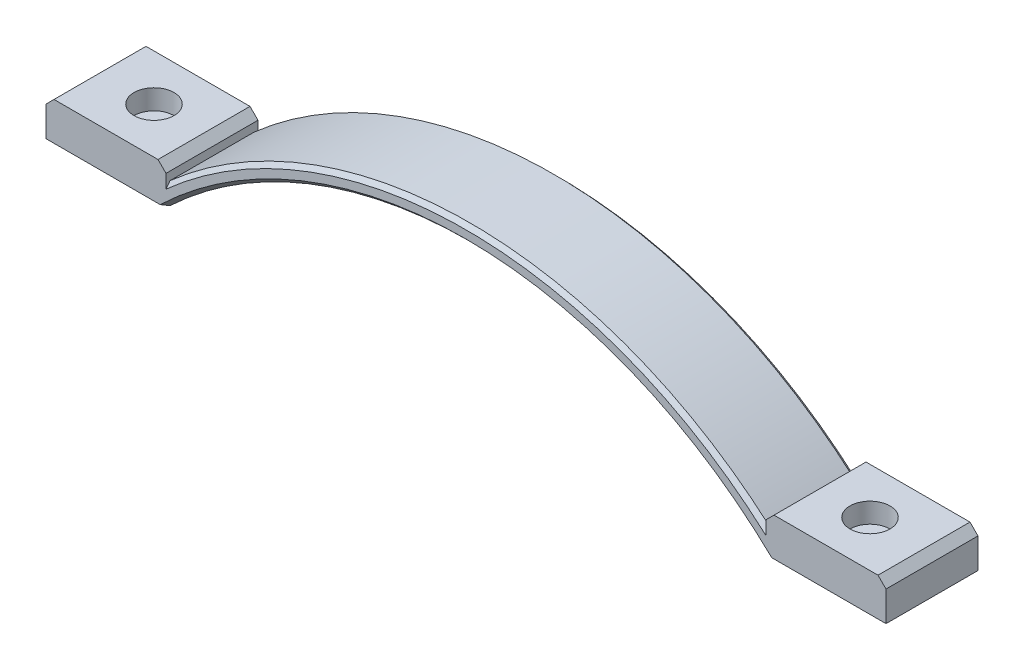
ISO-10303-21;
HEADER;
FILE_DESCRIPTION(('STEP AP214'),'2;1');
FILE_NAME('part.step','',(''),(''),'','','');
FILE_SCHEMA(('AUTOMOTIVE_DESIGN { 1 0 10303 214 1 1 1 1 }'));
ENDSEC;
DATA;
#1=APPLICATION_CONTEXT('core data for automotive mechanical design processes');
#2=APPLICATION_PROTOCOL_DEFINITION('international standard','automotive_design',2000,#1);
#3=PRODUCT_CONTEXT('',#1,'mechanical');
#4=PRODUCT('Part','Part','',(#3));
#5=PRODUCT_RELATED_PRODUCT_CATEGORY('part','',(#4));
#6=PRODUCT_DEFINITION_FORMATION('','',#4);
#7=PRODUCT_DEFINITION_CONTEXT('part definition',#1,'design');
#8=PRODUCT_DEFINITION('design','',#6,#7);
#9=PRODUCT_DEFINITION_SHAPE('','',#8);
#10=(LENGTH_UNIT() NAMED_UNIT(*) SI_UNIT(.MILLI.,.METRE.));
#11=(NAMED_UNIT(*) PLANE_ANGLE_UNIT() SI_UNIT($,.RADIAN.));
#12=(NAMED_UNIT(*) SI_UNIT($,.STERADIAN.) SOLID_ANGLE_UNIT());
#13=UNCERTAINTY_MEASURE_WITH_UNIT(LENGTH_MEASURE(1.E-05),#10,'distance_accuracy_value','');
#14=(GEOMETRIC_REPRESENTATION_CONTEXT(3) GLOBAL_UNCERTAINTY_ASSIGNED_CONTEXT((#13)) GLOBAL_UNIT_ASSIGNED_CONTEXT((#10,
#11,#12)) REPRESENTATION_CONTEXT('',''));
#15=CARTESIAN_POINT('',(0.,0.,0.));
#16=DIRECTION('',(0.,0.,1.));
#17=DIRECTION('',(1.,0.,0.));
#18=AXIS2_PLACEMENT_3D('',#15,#16,#17);
#19=CARTESIAN_POINT('',(-105.,0.,-11.5));
#20=DIRECTION('',(-1.,0.,0.));
#21=DIRECTION('',(0.,0.,1.));
#22=AXIS2_PLACEMENT_3D('',#19,#20,#21);
#23=PLANE('',#22);
#24=DIRECTION('',(0.,-1.,0.));
#25=VECTOR('',#24,1.);
#26=CARTESIAN_POINT('',(-105.,0.,11.5));
#27=LINE('',#26,#25);
#28=CARTESIAN_POINT('',(-105.,7.50000000000003,11.5));
#29=VERTEX_POINT('',#28);
#30=CARTESIAN_POINT('',(-105.,0.,11.5));
#31=VERTEX_POINT('',#30);
#32=EDGE_CURVE('E164',#29,#31,#27,.T.);
#33=ORIENTED_EDGE('',*,*,#32,.F.);
#34=DIRECTION('',(0.,0.,-1.));
#35=VECTOR('',#34,1.);
#36=CARTESIAN_POINT('',(-105.,7.50000000000003,-11.5));
#37=LINE('',#36,#35);
#38=CARTESIAN_POINT('',(-105.,7.50000000000002,-11.5));
#39=VERTEX_POINT('',#38);
#40=EDGE_CURVE('E362',#29,#39,#37,.T.);
#41=ORIENTED_EDGE('',*,*,#40,.T.);
#42=DIRECTION('',(0.,-1.,0.));
#43=VECTOR('',#42,1.);
#44=CARTESIAN_POINT('',(-105.,0.,-11.5));
#45=LINE('',#44,#43);
#46=CARTESIAN_POINT('',(-105.,0.,-11.5));
#47=VERTEX_POINT('',#46);
#48=EDGE_CURVE('E180',#39,#47,#45,.T.);
#49=ORIENTED_EDGE('',*,*,#48,.T.);
#50=DIRECTION('',(0.,0.,1.));
#51=VECTOR('',#50,1.);
#52=CARTESIAN_POINT('',(-105.,0.,-11.5));
#53=LINE('',#52,#51);
#54=EDGE_CURVE('E178',#47,#31,#53,.T.);
#55=ORIENTED_EDGE('',*,*,#54,.T.);
#56=EDGE_LOOP('',(#33,#41,#49,#55));
#57=FACE_BOUND('',#56,.T.);
#58=ADVANCED_FACE('F37',(#57),#23,.T.);
#59=CARTESIAN_POINT('',(-105.,9.5,-11.5));
#60=DIRECTION('',(0.,1.,0.));
#61=DIRECTION('',(0.,0.,1.));
#62=AXIS2_PLACEMENT_3D('',#59,#60,#61);
#63=PLANE('',#62);
#64=CARTESIAN_POINT('',(-89.5,9.5,0.));
#65=DIRECTION('',(0.,1.,0.));
#66=DIRECTION('',(0.,0.,1.));
#67=AXIS2_PLACEMENT_3D('',#64,#65,#66);
#68=CIRCLE('',#67,5.);
#69=CARTESIAN_POINT('',(-89.5,9.5,5.));
#70=VERTEX_POINT('',#69);
#71=EDGE_CURVE('E606',#70,#70,#68,.T.);
#72=ORIENTED_EDGE('',*,*,#71,.F.);
#73=EDGE_LOOP('',(#72));
#74=FACE_BOUND('',#73,.T.);
#75=DIRECTION('',(-1.,0.,0.));
#76=VECTOR('',#75,1.);
#77=CARTESIAN_POINT('',(-105.,9.5,-11.5));
#78=LINE('',#77,#76);
#79=CARTESIAN_POINT('',(-77.,9.5,-11.5));
#80=VERTEX_POINT('',#79);
#81=CARTESIAN_POINT('',(-103.,9.5,-11.5));
#82=VERTEX_POINT('',#81);
#83=EDGE_CURVE('E185',#80,#82,#78,.T.);
#84=ORIENTED_EDGE('',*,*,#83,.T.);
#85=DIRECTION('',(0.,0.,1.));
#86=VECTOR('',#85,1.);
#87=CARTESIAN_POINT('',(-103.,9.5,-11.5));
#88=LINE('',#87,#86);
#89=CARTESIAN_POINT('',(-103.,9.5,11.5));
#90=VERTEX_POINT('',#89);
#91=EDGE_CURVE('E414',#82,#90,#88,.T.);
#92=ORIENTED_EDGE('',*,*,#91,.T.);
#93=DIRECTION('',(-1.,0.,0.));
#94=VECTOR('',#93,1.);
#95=CARTESIAN_POINT('',(-105.,9.5,11.5));
#96=LINE('',#95,#94);
#97=CARTESIAN_POINT('',(-77.,9.5,11.5));
#98=VERTEX_POINT('',#97);
#99=EDGE_CURVE('E207',#98,#90,#96,.T.);
#100=ORIENTED_EDGE('',*,*,#99,.F.);
#101=DIRECTION('',(0.,0.,-1.));
#102=VECTOR('',#101,1.);
#103=CARTESIAN_POINT('',(-77.,9.5,-11.5));
#104=LINE('',#103,#102);
#105=EDGE_CURVE('E419',#98,#80,#104,.T.);
#106=ORIENTED_EDGE('',*,*,#105,.T.);
#107=EDGE_LOOP('',(#84,#92,#100,#106));
#108=FACE_BOUND('',#107,.T.);
#109=ADVANCED_FACE('F291',(#74,#108),#63,.T.);
#110=CARTESIAN_POINT('',(-75.,9.5,-11.5));
#111=DIRECTION('',(1.,0.,0.));
#112=DIRECTION('',(0.,0.,-1.));
#113=AXIS2_PLACEMENT_3D('',#110,#111,#112);
#114=PLANE('',#113);
#115=DIRECTION('',(0.,1.,0.));
#116=VECTOR('',#115,1.);
#117=CARTESIAN_POINT('',(-75.,9.5,-11.5));
#118=LINE('',#117,#116);
#119=CARTESIAN_POINT('',(-75.,4.07562753796724,-11.5));
#120=VERTEX_POINT('',#119);
#121=CARTESIAN_POINT('',(-75.,7.49999999999997,-11.5));
#122=VERTEX_POINT('',#121);
#123=EDGE_CURVE('E220',#120,#122,#118,.T.);
#124=ORIENTED_EDGE('',*,*,#123,.T.);
#125=DIRECTION('',(0.,0.,1.));
#126=VECTOR('',#125,1.);
#127=CARTESIAN_POINT('',(-75.,7.49999999999997,-11.5));
#128=LINE('',#127,#126);
#129=CARTESIAN_POINT('',(-75.,7.49999999999999,11.5));
#130=VERTEX_POINT('',#129);
#131=EDGE_CURVE('E367',#122,#130,#128,.T.);
#132=ORIENTED_EDGE('',*,*,#131,.T.);
#133=DIRECTION('',(0.,1.,0.));
#134=VECTOR('',#133,1.);
#135=CARTESIAN_POINT('',(-75.,9.5,11.5));
#136=LINE('',#135,#134);
#137=CARTESIAN_POINT('',(-75.,4.07562753796728,11.5));
#138=VERTEX_POINT('',#137);
#139=EDGE_CURVE('E204',#138,#130,#136,.T.);
#140=ORIENTED_EDGE('',*,*,#139,.F.);
#141=CARTESIAN_POINT('',(-75.,4.07562753796728,11.5));
#142=CARTESIAN_POINT('',(-75.,4.29901392061839,11.3337087795045));
#143=CARTESIAN_POINT('',(-75.,4.52226006841741,11.1672298356614));
#144=CARTESIAN_POINT('',(-75.,4.96847189291119,10.8338965023257));
#145=CARTESIAN_POINT('',(-75.,5.19143756960771,10.6670421128355));
#146=CARTESIAN_POINT('',(-75.,5.4142630114539,10.5));
#147=B_SPLINE_CURVE_WITH_KNOTS('',3,(#141,#142,#143,#144,#145,#146),.UNSPECIFIED.,.F.,.F.,(4,2,
4),(0.,0.835456001984573,1.67091199872642),.UNSPECIFIED.);
#148=CARTESIAN_POINT('',(-75.,5.4142630114539,10.5));
#149=VERTEX_POINT('',#148);
#150=EDGE_CURVE('E320',#138,#149,#147,.T.);
#151=ORIENTED_EDGE('',*,*,#150,.T.);
#152=DIRECTION('',(0.,0.,1.));
#153=VECTOR('',#152,1.);
#154=CARTESIAN_POINT('',(-75.,5.4142630114539,-11.5));
#155=LINE('',#154,#153);
#156=CARTESIAN_POINT('',(-75.,5.4142630114539,-10.5));
#157=VERTEX_POINT('',#156);
#158=EDGE_CURVE('E225',#157,#149,#155,.T.);
#159=ORIENTED_EDGE('',*,*,#158,.F.);
#160=CARTESIAN_POINT('',(-75.,5.4142630114539,-10.5));
#161=CARTESIAN_POINT('',(-75.,5.19143756960771,-10.6670421128355));
#162=CARTESIAN_POINT('',(-75.,4.96847189291118,-10.8338965023257));
#163=CARTESIAN_POINT('',(-75.,4.52226006841739,-11.1672298356614));
#164=CARTESIAN_POINT('',(-75.,4.29901392061837,-11.3337087795045));
#165=CARTESIAN_POINT('',(-75.,4.07562753796724,-11.5));
#166=B_SPLINE_CURVE_WITH_KNOTS('',3,(#160,#161,#162,#163,#164,#165),.UNSPECIFIED.,.F.,.F.,(4,2,
4),(0.,0.835455996741874,1.67091199872648),.UNSPECIFIED.);
#167=EDGE_CURVE('E313',#157,#120,#166,.T.);
#168=ORIENTED_EDGE('',*,*,#167,.T.);
#169=EDGE_LOOP('',(#124,#132,#140,#151,#159,#168));
#170=FACE_BOUND('',#169,.T.);
#171=ADVANCED_FACE('F295',(#170),#114,.T.);
#172=CARTESIAN_POINT('',(0.,-79.5344507533778,-11.5));
#173=DIRECTION('',(0.,0.,1.));
#174=DIRECTION('',(1.,0.,0.));
#175=AXIS2_PLACEMENT_3D('',#172,#173,#174);
#176=CYLINDRICAL_SURFACE('',#175,113.319389207228);
#177=DIRECTION('',(0.,0.,1.));
#178=VECTOR('',#177,1.);
#179=CARTESIAN_POINT('',(75.,5.4142630114539,-11.5));
#180=LINE('',#179,#178);
#181=CARTESIAN_POINT('',(75.,5.4142630114539,-10.5));
#182=VERTEX_POINT('',#181);
#183=CARTESIAN_POINT('',(75.,5.4142630114539,10.5));
#184=VERTEX_POINT('',#183);
#185=EDGE_CURVE('E229',#182,#184,#180,.T.);
#186=ORIENTED_EDGE('',*,*,#185,.F.);
#187=CARTESIAN_POINT('',(0.,-79.5344507533778,-10.5));
#188=DIRECTION('',(0.,0.,1.));
#189=DIRECTION('',(1.,0.,0.));
#190=AXIS2_PLACEMENT_3D('',#187,#188,#189);
#191=CIRCLE('',#190,113.319389207228);
#192=EDGE_CURVE('E385',#182,#157,#191,.T.);
#193=ORIENTED_EDGE('',*,*,#192,.T.);
#194=ORIENTED_EDGE('',*,*,#158,.T.);
#195=CARTESIAN_POINT('',(0.,-79.5344507533778,10.5));
#196=DIRECTION('',(0.,0.,1.));
#197=DIRECTION('',(1.,0.,0.));
#198=AXIS2_PLACEMENT_3D('',#195,#196,#197);
#199=CIRCLE('',#198,113.319389207228);
#200=EDGE_CURVE('E388',#149,#184,#199,.F.);
#201=ORIENTED_EDGE('',*,*,#200,.T.);
#202=EDGE_LOOP('',(#186,#193,#194,#201));
#203=FACE_BOUND('',#202,.T.);
#204=ADVANCED_FACE('F301',(#203),#176,.T.);
#205=CARTESIAN_POINT('',(75.,9.5,-11.5));
#206=DIRECTION('',(-1.,0.,0.));
#207=DIRECTION('',(0.,0.,1.));
#208=AXIS2_PLACEMENT_3D('',#205,#206,#207);
#209=PLANE('',#208);
#210=DIRECTION('',(0.,-1.,0.));
#211=VECTOR('',#210,1.);
#212=CARTESIAN_POINT('',(75.,9.5,11.5));
#213=LINE('',#212,#211);
#214=CARTESIAN_POINT('',(75.,7.49999999999997,11.5));
#215=VERTEX_POINT('',#214);
#216=CARTESIAN_POINT('',(75.,4.07562753796728,11.5));
#217=VERTEX_POINT('',#216);
#218=EDGE_CURVE('E202',#215,#217,#213,.T.);
#219=ORIENTED_EDGE('',*,*,#218,.F.);
#220=DIRECTION('',(0.,0.,-1.));
#221=VECTOR('',#220,1.);
#222=CARTESIAN_POINT('',(75.,7.49999999999997,-11.5));
#223=LINE('',#222,#221);
#224=CARTESIAN_POINT('',(75.,7.49999999999997,-11.5));
#225=VERTEX_POINT('',#224);
#226=EDGE_CURVE('E45',#215,#225,#223,.T.);
#227=ORIENTED_EDGE('',*,*,#226,.T.);
#228=DIRECTION('',(0.,-1.,0.));
#229=VECTOR('',#228,1.);
#230=CARTESIAN_POINT('',(75.,9.5,-11.5));
#231=LINE('',#230,#229);
#232=CARTESIAN_POINT('',(75.,4.07562753796724,-11.5));
#233=VERTEX_POINT('',#232);
#234=EDGE_CURVE('E218',#225,#233,#231,.T.);
#235=ORIENTED_EDGE('',*,*,#234,.T.);
#236=CARTESIAN_POINT('',(75.,4.07562753796724,-11.5));
#237=CARTESIAN_POINT('',(75.,4.29901392061837,-11.3337087795045));
#238=CARTESIAN_POINT('',(75.,4.52226006841739,-11.1672298356614));
#239=CARTESIAN_POINT('',(75.,4.96847189291119,-10.8338965023257));
#240=CARTESIAN_POINT('',(75.,5.19143756960771,-10.6670421128355));
#241=CARTESIAN_POINT('',(75.,5.41426301145389,-10.5));
#242=B_SPLINE_CURVE_WITH_KNOTS('',3,(#236,#237,#238,#239,#240,#241),.UNSPECIFIED.,.F.,.F.,(4,2,
4),(0.,0.835456001984603,1.67091199872648),.UNSPECIFIED.);
#243=EDGE_CURVE('E326',#233,#182,#242,.T.);
#244=ORIENTED_EDGE('',*,*,#243,.T.);
#245=ORIENTED_EDGE('',*,*,#185,.T.);
#246=CARTESIAN_POINT('',(75.,5.4142630114539,10.5));
#247=CARTESIAN_POINT('',(75.,5.19143756960771,10.6670421128355));
#248=CARTESIAN_POINT('',(75.,4.96847189291119,10.8338965023257));
#249=CARTESIAN_POINT('',(75.,4.52226006841741,11.1672298356614));
#250=CARTESIAN_POINT('',(75.,4.29901392061839,11.3337087795045));
#251=CARTESIAN_POINT('',(75.,4.07562753796728,11.5));
#252=B_SPLINE_CURVE_WITH_KNOTS('',3,(#246,#247,#248,#249,#250,#251),.UNSPECIFIED.,.F.,.F.,(4,2,
4),(0.,0.835455996741844,1.67091199872642),.UNSPECIFIED.);
#253=EDGE_CURVE('E325',#184,#217,#252,.T.);
#254=ORIENTED_EDGE('',*,*,#253,.T.);
#255=EDGE_LOOP('',(#219,#227,#235,#244,#245,#254));
#256=FACE_BOUND('',#255,.T.);
#257=ADVANCED_FACE('F374',(#256),#209,.T.);
#258=CARTESIAN_POINT('',(105.,9.50000000000003,-11.5));
#259=DIRECTION('',(0.,1.,0.));
#260=DIRECTION('',(-1.,0.,0.));
#261=AXIS2_PLACEMENT_3D('',#258,#259,#260);
#262=PLANE('',#261);
#263=CARTESIAN_POINT('',(89.5,9.5,0.));
#264=DIRECTION('',(0.,1.,0.));
#265=DIRECTION('',(0.,0.,-1.));
#266=AXIS2_PLACEMENT_3D('',#263,#264,#265);
#267=CIRCLE('',#266,5.);
#268=CARTESIAN_POINT('',(89.5,9.5,-5.00000000000003));
#269=VERTEX_POINT('',#268);
#270=EDGE_CURVE('E607',#269,#269,#267,.T.);
#271=ORIENTED_EDGE('',*,*,#270,.F.);
#272=EDGE_LOOP('',(#271));
#273=FACE_BOUND('',#272,.T.);
#274=DIRECTION('',(-1.,0.,0.));
#275=VECTOR('',#274,1.);
#276=CARTESIAN_POINT('',(105.,9.50000000000003,-11.5));
#277=LINE('',#276,#275);
#278=CARTESIAN_POINT('',(103.,9.50000000000002,-11.5));
#279=VERTEX_POINT('',#278);
#280=CARTESIAN_POINT('',(77.,9.5,-11.5));
#281=VERTEX_POINT('',#280);
#282=EDGE_CURVE('E216',#279,#281,#277,.T.);
#283=ORIENTED_EDGE('',*,*,#282,.T.);
#284=DIRECTION('',(0.,0.,1.));
#285=VECTOR('',#284,1.);
#286=CARTESIAN_POINT('',(77.,9.5,-11.5));
#287=LINE('',#286,#285);
#288=CARTESIAN_POINT('',(77.0000000000001,9.50000000000002,11.5));
#289=VERTEX_POINT('',#288);
#290=EDGE_CURVE('E357',#281,#289,#287,.T.);
#291=ORIENTED_EDGE('',*,*,#290,.T.);
#292=DIRECTION('',(-1.,0.,0.));
#293=VECTOR('',#292,1.);
#294=CARTESIAN_POINT('',(105.,9.50000000000003,11.5));
#295=LINE('',#294,#293);
#296=CARTESIAN_POINT('',(103.,9.50000000000002,11.5));
#297=VERTEX_POINT('',#296);
#298=EDGE_CURVE('E199',#297,#289,#295,.T.);
#299=ORIENTED_EDGE('',*,*,#298,.F.);
#300=DIRECTION('',(0.,0.,-1.));
#301=VECTOR('',#300,1.);
#302=CARTESIAN_POINT('',(103.,9.50000000000002,-11.5));
#303=LINE('',#302,#301);
#304=EDGE_CURVE('E370',#297,#279,#303,.T.);
#305=ORIENTED_EDGE('',*,*,#304,.T.);
#306=EDGE_LOOP('',(#283,#291,#299,#305));
#307=FACE_BOUND('',#306,.T.);
#308=ADVANCED_FACE('F438',(#273,#307),#262,.T.);
#309=CARTESIAN_POINT('',(105.,0.,-11.5));
#310=DIRECTION('',(1.,0.,0.));
#311=DIRECTION('',(0.,1.,0.));
#312=AXIS2_PLACEMENT_3D('',#309,#310,#311);
#313=PLANE('',#312);
#314=DIRECTION('',(0.,1.,0.));
#315=VECTOR('',#314,1.);
#316=CARTESIAN_POINT('',(105.,0.,-11.5));
#317=LINE('',#316,#315);
#318=CARTESIAN_POINT('',(105.,0.,-11.5));
#319=VERTEX_POINT('',#318);
#320=CARTESIAN_POINT('',(105.,7.49999999999999,-11.5));
#321=VERTEX_POINT('',#320);
#322=EDGE_CURVE('E214',#319,#321,#317,.T.);
#323=ORIENTED_EDGE('',*,*,#322,.T.);
#324=DIRECTION('',(0.,0.,1.));
#325=VECTOR('',#324,1.);
#326=CARTESIAN_POINT('',(105.,7.49999999999999,-11.5));
#327=LINE('',#326,#325);
#328=CARTESIAN_POINT('',(105.,7.49999999999997,11.5));
#329=VERTEX_POINT('',#328);
#330=EDGE_CURVE('E11',#321,#329,#327,.T.);
#331=ORIENTED_EDGE('',*,*,#330,.T.);
#332=DIRECTION('',(0.,1.,0.));
#333=VECTOR('',#332,1.);
#334=CARTESIAN_POINT('',(105.,0.,11.5));
#335=LINE('',#334,#333);
#336=CARTESIAN_POINT('',(105.,0.,11.5));
#337=VERTEX_POINT('',#336);
#338=EDGE_CURVE('E193',#337,#329,#335,.T.);
#339=ORIENTED_EDGE('',*,*,#338,.F.);
#340=DIRECTION('',(0.,0.,1.));
#341=VECTOR('',#340,1.);
#342=CARTESIAN_POINT('',(105.,0.,-11.5));
#343=LINE('',#342,#341);
#344=EDGE_CURVE('E232',#319,#337,#343,.T.);
#345=ORIENTED_EDGE('',*,*,#344,.F.);
#346=EDGE_LOOP('',(#323,#331,#339,#345));
#347=FACE_BOUND('',#346,.T.);
#348=ADVANCED_FACE('F408',(#347),#313,.T.);
#349=CARTESIAN_POINT('',(105.,0.,-11.5));
#350=DIRECTION('',(0.,-1.,0.));
#351=DIRECTION('',(1.,0.,0.));
#352=AXIS2_PLACEMENT_3D('',#349,#350,#351);
#353=PLANE('',#352);
#354=DIRECTION('',(1.,0.,0.));
#355=VECTOR('',#354,1.);
#356=CARTESIAN_POINT('',(105.,0.,11.5));
#357=LINE('',#356,#355);
#358=CARTESIAN_POINT('',(76.4502372685295,0.,11.5));
#359=VERTEX_POINT('',#358);
#360=EDGE_CURVE('E191',#359,#337,#357,.T.);
#361=ORIENTED_EDGE('',*,*,#360,.F.);
#362=CARTESIAN_POINT('',(76.4502372685295,0.,11.5));
#363=CARTESIAN_POINT('',(76.2089222787129,0.,11.3327659724251));
#364=CARTESIAN_POINT('',(75.967411678853,0.,11.1658156258252));
#365=CARTESIAN_POINT('',(75.4839992560148,0.,10.8324822924848));
#366=CARTESIAN_POINT('',(75.2420974330315,0.,10.6660993057514));
#367=CARTESIAN_POINT('',(75.,0.,10.5));
#368=B_SPLINE_CURVE_WITH_KNOTS('',3,(#362,#363,#364,#365,#366,#367),.UNSPECIFIED.,.F.,.F.,(4,2,
4),(0.,0.880794012621937,1.76158803629188),.UNSPECIFIED.);
#369=CARTESIAN_POINT('',(75.,0.,10.5));
#370=VERTEX_POINT('',#369);
#371=EDGE_CURVE('E250',#359,#370,#368,.T.);
#372=ORIENTED_EDGE('',*,*,#371,.T.);
#373=DIRECTION('',(0.,0.,1.));
#374=VECTOR('',#373,1.);
#375=CARTESIAN_POINT('',(75.,0.,-11.5));
#376=LINE('',#375,#374);
#377=CARTESIAN_POINT('',(75.,0.,-10.5));
#378=VERTEX_POINT('',#377);
#379=EDGE_CURVE('E235',#378,#370,#376,.T.);
#380=ORIENTED_EDGE('',*,*,#379,.F.);
#381=CARTESIAN_POINT('',(75.,0.,-10.5));
#382=CARTESIAN_POINT('',(75.2420974330315,0.,-10.6660993057514));
#383=CARTESIAN_POINT('',(75.4839992560148,0.,-10.8324822924848));
#384=CARTESIAN_POINT('',(75.9674116788531,0.,-11.1658156258252));
#385=CARTESIAN_POINT('',(76.2089222787129,0.,-11.3327659724252));
#386=CARTESIAN_POINT('',(76.4502372685295,0.,-11.5));
#387=B_SPLINE_CURVE_WITH_KNOTS('',3,(#381,#382,#383,#384,#385,#386),.UNSPECIFIED.,.F.,.F.,(4,2,
4),(0.,0.880794023669939,1.76158803629186),.UNSPECIFIED.);
#388=CARTESIAN_POINT('',(76.4502372685295,0.,-11.5));
#389=VERTEX_POINT('',#388);
#390=EDGE_CURVE('E243',#378,#389,#387,.T.);
#391=ORIENTED_EDGE('',*,*,#390,.T.);
#392=DIRECTION('',(1.,0.,0.));
#393=VECTOR('',#392,1.);
#394=CARTESIAN_POINT('',(105.,0.,-11.5));
#395=LINE('',#394,#393);
#396=EDGE_CURVE('E212',#389,#319,#395,.T.);
#397=ORIENTED_EDGE('',*,*,#396,.T.);
#398=ORIENTED_EDGE('',*,*,#344,.T.);
#399=EDGE_LOOP('',(#361,#372,#380,#391,#397,#398));
#400=FACE_BOUND('',#399,.T.);
#401=ADVANCED_FACE('F256',(#400),#353,.T.);
#402=CARTESIAN_POINT('',(0.,-79.5344507533778,-11.5));
#403=DIRECTION('',(0.,0.,1.));
#404=DIRECTION('',(1.,0.,0.));
#405=AXIS2_PLACEMENT_3D('',#402,#403,#404);
#406=CYLINDRICAL_SURFACE('',#405,109.319389207228);
#407=ORIENTED_EDGE('',*,*,#379,.T.);
#408=CARTESIAN_POINT('',(0.,-79.5344507533778,10.5));
#409=DIRECTION('',(0.,0.,1.));
#410=DIRECTION('',(1.,0.,0.));
#411=AXIS2_PLACEMENT_3D('',#408,#409,#410);
#412=CIRCLE('',#411,109.319389207228);
#413=CARTESIAN_POINT('',(-75.,0.,10.5));
#414=VERTEX_POINT('',#413);
#415=EDGE_CURVE('E280',#370,#414,#412,.T.);
#416=ORIENTED_EDGE('',*,*,#415,.T.);
#417=DIRECTION('',(0.,0.,1.));
#418=VECTOR('',#417,1.);
#419=CARTESIAN_POINT('',(-75.,0.,-11.5));
#420=LINE('',#419,#418);
#421=CARTESIAN_POINT('',(-75.,0.,-10.5));
#422=VERTEX_POINT('',#421);
#423=EDGE_CURVE('E184',#422,#414,#420,.T.);
#424=ORIENTED_EDGE('',*,*,#423,.F.);
#425=CARTESIAN_POINT('',(0.,-79.5344507533778,-10.5));
#426=DIRECTION('',(0.,0.,1.));
#427=DIRECTION('',(1.,0.,0.));
#428=AXIS2_PLACEMENT_3D('',#425,#426,#427);
#429=CIRCLE('',#428,109.319389207228);
#430=EDGE_CURVE('E398',#422,#378,#429,.F.);
#431=ORIENTED_EDGE('',*,*,#430,.T.);
#432=EDGE_LOOP('',(#407,#416,#424,#431));
#433=FACE_BOUND('',#432,.T.);
#434=ADVANCED_FACE('F288',(#433),#406,.F.);
#435=CARTESIAN_POINT('',(-105.,0.,-11.5));
#436=DIRECTION('',(0.,-1.,0.));
#437=DIRECTION('',(0.,0.,-1.));
#438=AXIS2_PLACEMENT_3D('',#435,#436,#437);
#439=PLANE('',#438);
#440=ORIENTED_EDGE('',*,*,#423,.T.);
#441=CARTESIAN_POINT('',(-75.,0.,10.5));
#442=CARTESIAN_POINT('',(-75.2420974330315,0.,10.6660993057514));
#443=CARTESIAN_POINT('',(-75.4839992560148,0.,10.8324822924848));
#444=CARTESIAN_POINT('',(-75.9674116788531,0.,11.1658156258252));
#445=CARTESIAN_POINT('',(-76.2089222787129,0.,11.3327659724251));
#446=CARTESIAN_POINT('',(-76.4502372685295,0.,11.5));
#447=B_SPLINE_CURVE_WITH_KNOTS('',3,(#441,#442,#443,#444,#445,#446),.UNSPECIFIED.,.F.,.F.,(4,2,
4),(0.,0.880794023669946,1.76158803629187),.UNSPECIFIED.);
#448=CARTESIAN_POINT('',(-76.4502372685295,0.,11.5));
#449=VERTEX_POINT('',#448);
#450=EDGE_CURVE('E190',#414,#449,#447,.T.);
#451=ORIENTED_EDGE('',*,*,#450,.T.);
#452=DIRECTION('',(1.,0.,0.));
#453=VECTOR('',#452,1.);
#454=CARTESIAN_POINT('',(-105.,0.,11.5));
#455=LINE('',#454,#453);
#456=EDGE_CURVE('E170',#31,#449,#455,.T.);
#457=ORIENTED_EDGE('',*,*,#456,.F.);
#458=ORIENTED_EDGE('',*,*,#54,.F.);
#459=DIRECTION('',(1.,0.,0.));
#460=VECTOR('',#459,1.);
#461=CARTESIAN_POINT('',(-105.,0.,-11.5));
#462=LINE('',#461,#460);
#463=CARTESIAN_POINT('',(-76.4502372685295,0.,-11.5));
#464=VERTEX_POINT('',#463);
#465=EDGE_CURVE('E210',#47,#464,#462,.T.);
#466=ORIENTED_EDGE('',*,*,#465,.T.);
#467=CARTESIAN_POINT('',(-76.4502372685295,0.,-11.5));
#468=CARTESIAN_POINT('',(-76.2089222787129,0.,-11.3327659724251));
#469=CARTESIAN_POINT('',(-75.967411678853,0.,-11.1658156258252));
#470=CARTESIAN_POINT('',(-75.4839992560148,0.,-10.8324822924848));
#471=CARTESIAN_POINT('',(-75.2420974330315,0.,-10.6660993057514));
#472=CARTESIAN_POINT('',(-75.,0.,-10.5));
#473=B_SPLINE_CURVE_WITH_KNOTS('',3,(#467,#468,#469,#470,#471,#472),.UNSPECIFIED.,.F.,.F.,(4,2,
4),(0.,0.880794012621929,1.76158803629186),.UNSPECIFIED.);
#474=EDGE_CURVE('E273',#464,#422,#473,.T.);
#475=ORIENTED_EDGE('',*,*,#474,.T.);
#476=EDGE_LOOP('',(#440,#451,#457,#458,#466,#475));
#477=FACE_BOUND('',#476,.T.);
#478=ADVANCED_FACE('F188',(#477),#439,.T.);
#479=CARTESIAN_POINT('',(0.,-79.5344507533778,-11.5));
#480=DIRECTION('',(0.,0.,1.));
#481=DIRECTION('',(1.,0.,0.));
#482=AXIS2_PLACEMENT_3D('',#479,#480,#481);
#483=PLANE('',#482);
#484=ORIENTED_EDGE('',*,*,#48,.F.);
#485=DIRECTION('',(-0.707106781186548,-0.707106781186548,0.));
#486=VECTOR('',#485,1.);
#487=CARTESIAN_POINT('',(-103.,9.5,-11.5));
#488=LINE('',#487,#486);
#489=EDGE_CURVE('E360',#39,#82,#488,.F.);
#490=ORIENTED_EDGE('',*,*,#489,.T.);
#491=ORIENTED_EDGE('',*,*,#83,.F.);
#492=DIRECTION('',(-0.707106781186548,0.707106781186548,0.));
#493=VECTOR('',#492,1.);
#494=CARTESIAN_POINT('',(-75.,7.49999999999997,-11.5));
#495=LINE('',#494,#493);
#496=EDGE_CURVE('E358',#80,#122,#495,.F.);
#497=ORIENTED_EDGE('',*,*,#496,.T.);
#498=ORIENTED_EDGE('',*,*,#123,.F.);
#499=CARTESIAN_POINT('',(0.,-79.5344507533778,-11.5));
#500=DIRECTION('',(0.,0.,1.));
#501=DIRECTION('',(1.,0.,0.));
#502=AXIS2_PLACEMENT_3D('',#499,#500,#501);
#503=CIRCLE('',#502,112.319389207228);
#504=EDGE_CURVE('E378',#120,#233,#503,.F.);
#505=ORIENTED_EDGE('',*,*,#504,.T.);
#506=ORIENTED_EDGE('',*,*,#234,.F.);
#507=DIRECTION('',(-0.707106781186548,-0.707106781186548,0.));
#508=VECTOR('',#507,1.);
#509=CARTESIAN_POINT('',(77.,9.5,-11.5));
#510=LINE('',#509,#508);
#511=EDGE_CURVE('E58',#225,#281,#510,.F.);
#512=ORIENTED_EDGE('',*,*,#511,.T.);
#513=ORIENTED_EDGE('',*,*,#282,.F.);
#514=DIRECTION('',(-0.707106781186548,0.707106781186547,0.));
#515=VECTOR('',#514,1.);
#516=CARTESIAN_POINT('',(105.,7.5,-11.5));
#517=LINE('',#516,#515);
#518=EDGE_CURVE('E52',#279,#321,#517,.F.);
#519=ORIENTED_EDGE('',*,*,#518,.T.);
#520=ORIENTED_EDGE('',*,*,#322,.F.);
#521=ORIENTED_EDGE('',*,*,#396,.F.);
#522=CARTESIAN_POINT('',(0.,-79.5344507533778,-11.5));
#523=DIRECTION('',(0.,0.,1.));
#524=DIRECTION('',(1.,0.,0.));
#525=AXIS2_PLACEMENT_3D('',#522,#523,#524);
#526=CIRCLE('',#525,110.319389207228);
#527=EDGE_CURVE('E382',#389,#464,#526,.T.);
#528=ORIENTED_EDGE('',*,*,#527,.T.);
#529=ORIENTED_EDGE('',*,*,#465,.F.);
#530=EDGE_LOOP('',(#484,#490,#491,#497,#498,#505,#506,#512,#513,#519,#520,#521,#528,#529));
#531=FACE_BOUND('',#530,.T.);
#532=ADVANCED_FACE('F287',(#531),#483,.F.);
#533=CARTESIAN_POINT('',(0.,-79.5344507533778,11.5));
#534=DIRECTION('',(0.,0.,1.));
#535=DIRECTION('',(1.,0.,0.));
#536=AXIS2_PLACEMENT_3D('',#533,#534,#535);
#537=PLANE('',#536);
#538=ORIENTED_EDGE('',*,*,#99,.T.);
#539=DIRECTION('',(0.707106781186548,0.707106781186548,0.));
#540=VECTOR('',#539,1.);
#541=CARTESIAN_POINT('',(-96.0172253766889,16.4827746233111,11.5));
#542=LINE('',#541,#540);
#543=EDGE_CURVE('E172',#90,#29,#542,.F.);
#544=ORIENTED_EDGE('',*,*,#543,.T.);
#545=ORIENTED_EDGE('',*,*,#32,.T.);
#546=ORIENTED_EDGE('',*,*,#456,.T.);
#547=CARTESIAN_POINT('',(0.,-79.5344507533778,11.5));
#548=DIRECTION('',(0.,0.,1.));
#549=DIRECTION('',(1.,0.,0.));
#550=AXIS2_PLACEMENT_3D('',#547,#548,#549);
#551=CIRCLE('',#550,110.319389207228);
#552=EDGE_CURVE('E241',#449,#359,#551,.F.);
#553=ORIENTED_EDGE('',*,*,#552,.T.);
#554=ORIENTED_EDGE('',*,*,#360,.T.);
#555=ORIENTED_EDGE('',*,*,#338,.T.);
#556=DIRECTION('',(0.707106781186548,-0.707106781186547,0.));
#557=VECTOR('',#556,1.);
#558=CARTESIAN_POINT('',(96.0172253766889,16.4827746233111,11.5));
#559=LINE('',#558,#557);
#560=EDGE_CURVE('E411',#329,#297,#559,.F.);
#561=ORIENTED_EDGE('',*,*,#560,.T.);
#562=ORIENTED_EDGE('',*,*,#298,.T.);
#563=DIRECTION('',(0.707106781186548,0.707106781186548,0.));
#564=VECTOR('',#563,1.);
#565=CARTESIAN_POINT('',(-6.01722537668891,-73.5172253766889,11.5));
#566=LINE('',#565,#564);
#567=EDGE_CURVE('E413',#289,#215,#566,.F.);
#568=ORIENTED_EDGE('',*,*,#567,.T.);
#569=ORIENTED_EDGE('',*,*,#218,.T.);
#570=CARTESIAN_POINT('',(0.,-79.5344507533778,11.5));
#571=DIRECTION('',(0.,0.,1.));
#572=DIRECTION('',(1.,0.,0.));
#573=AXIS2_PLACEMENT_3D('',#570,#571,#572);
#574=CIRCLE('',#573,112.319389207228);
#575=EDGE_CURVE('E228',#217,#138,#574,.T.);
#576=ORIENTED_EDGE('',*,*,#575,.T.);
#577=ORIENTED_EDGE('',*,*,#139,.T.);
#578=DIRECTION('',(0.707106781186548,-0.707106781186548,0.));
#579=VECTOR('',#578,1.);
#580=CARTESIAN_POINT('',(6.0172253766889,-73.5172253766889,11.5));
#581=LINE('',#580,#579);
#582=EDGE_CURVE('E416',#130,#98,#581,.F.);
#583=ORIENTED_EDGE('',*,*,#582,.T.);
#584=EDGE_LOOP('',(#538,#544,#545,#546,#553,#554,#555,#561,#562,#568,#569,#576,#577,#583));
#585=FACE_BOUND('',#584,.T.);
#586=ADVANCED_FACE('F167',(#585),#537,.T.);
#587=CARTESIAN_POINT('',(-89.5,4.5,0.));
#588=DIRECTION('',(0.,1.,0.));
#589=DIRECTION('',(0.,0.,1.));
#590=AXIS2_PLACEMENT_3D('',#587,#588,#589);
#591=CYLINDRICAL_SURFACE('',#590,5.);
#592=CARTESIAN_POINT('',(-89.5,4.5,0.));
#593=DIRECTION('',(0.,1.,0.));
#594=DIRECTION('',(0.,0.,1.));
#595=AXIS2_PLACEMENT_3D('',#592,#593,#594);
#596=CIRCLE('',#595,5.);
#597=CARTESIAN_POINT('',(-89.5,4.5,5.));
#598=VERTEX_POINT('',#597);
#599=EDGE_CURVE('E175',#598,#598,#596,.T.);
#600=ORIENTED_EDGE('',*,*,#599,.F.);
#601=EDGE_LOOP('',(#600));
#602=FACE_BOUND('',#601,.T.);
#603=ORIENTED_EDGE('',*,*,#71,.T.);
#604=EDGE_LOOP('',(#603));
#605=FACE_BOUND('',#604,.T.);
#606=ADVANCED_FACE('F471',(#602,#605),#591,.F.);
#607=CARTESIAN_POINT('',(-89.5,4.5,0.));
#608=DIRECTION('',(0.,1.,0.));
#609=DIRECTION('',(0.,0.,1.));
#610=AXIS2_PLACEMENT_3D('',#607,#608,#609);
#611=PLANE('',#610);
#612=ORIENTED_EDGE('',*,*,#599,.T.);
#613=EDGE_LOOP('',(#612));
#614=FACE_BOUND('',#613,.T.);
#615=ADVANCED_FACE('F478',(#614),#611,.T.);
#616=CARTESIAN_POINT('',(89.5,4.5,0.));
#617=DIRECTION('',(0.,1.,0.));
#618=DIRECTION('',(0.,0.,1.));
#619=AXIS2_PLACEMENT_3D('',#616,#617,#618);
#620=CYLINDRICAL_SURFACE('',#619,5.);
#621=CARTESIAN_POINT('',(89.5,4.5,0.));
#622=DIRECTION('',(0.,1.,0.));
#623=DIRECTION('',(0.,0.,-1.));
#624=AXIS2_PLACEMENT_3D('',#621,#622,#623);
#625=CIRCLE('',#624,5.);
#626=CARTESIAN_POINT('',(89.5,4.5,-5.00000000000003));
#627=VERTEX_POINT('',#626);
#628=EDGE_CURVE('E605',#627,#627,#625,.T.);
#629=ORIENTED_EDGE('',*,*,#628,.F.);
#630=EDGE_LOOP('',(#629));
#631=FACE_BOUND('',#630,.T.);
#632=ORIENTED_EDGE('',*,*,#270,.T.);
#633=EDGE_LOOP('',(#632));
#634=FACE_BOUND('',#633,.T.);
#635=ADVANCED_FACE('F486',(#631,#634),#620,.F.);
#636=CARTESIAN_POINT('',(89.5,4.5,0.));
#637=DIRECTION('',(0.,-1.,0.));
#638=DIRECTION('',(0.,0.,-1.));
#639=AXIS2_PLACEMENT_3D('',#636,#637,#638);
#640=PLANE('',#639);
#641=ORIENTED_EDGE('',*,*,#628,.T.);
#642=EDGE_LOOP('',(#641));
#643=FACE_BOUND('',#642,.T.);
#644=ADVANCED_FACE('F494',(#643),#640,.F.);
#645=CARTESIAN_POINT('',(0.,-79.5344507533778,11.5));
#646=DIRECTION('',(0.,0.,1.));
#647=DIRECTION('',(1.,0.,0.));
#648=AXIS2_PLACEMENT_3D('',#645,#646,#647);
#649=CONICAL_SURFACE('',#648,110.319389207228,0.785398163397448);
#650=ORIENTED_EDGE('',*,*,#450,.F.);
#651=ORIENTED_EDGE('',*,*,#415,.F.);
#652=ORIENTED_EDGE('',*,*,#371,.F.);
#653=ORIENTED_EDGE('',*,*,#552,.F.);
#654=EDGE_LOOP('',(#650,#651,#652,#653));
#655=FACE_BOUND('',#654,.T.);
#656=ADVANCED_FACE('F265',(#655),#649,.F.);
#657=CARTESIAN_POINT('',(0.,-79.5344507533778,-10.5));
#658=DIRECTION('',(0.,0.,-1.));
#659=DIRECTION('',(-1.,0.,0.));
#660=AXIS2_PLACEMENT_3D('',#657,#658,#659);
#661=CONICAL_SURFACE('',#660,109.319389207228,0.785398163397462);
#662=ORIENTED_EDGE('',*,*,#474,.F.);
#663=ORIENTED_EDGE('',*,*,#527,.F.);
#664=ORIENTED_EDGE('',*,*,#390,.F.);
#665=ORIENTED_EDGE('',*,*,#430,.F.);
#666=EDGE_LOOP('',(#662,#663,#664,#665));
#667=FACE_BOUND('',#666,.T.);
#668=ADVANCED_FACE('F260',(#667),#661,.F.);
#669=CARTESIAN_POINT('',(0.,-79.5344507533778,-10.5));
#670=DIRECTION('',(0.,0.,1.));
#671=DIRECTION('',(1.,0.,0.));
#672=AXIS2_PLACEMENT_3D('',#669,#670,#671);
#673=CONICAL_SURFACE('',#672,113.319389207228,0.785398163397448);
#674=ORIENTED_EDGE('',*,*,#243,.F.);
#675=ORIENTED_EDGE('',*,*,#504,.F.);
#676=ORIENTED_EDGE('',*,*,#167,.F.);
#677=ORIENTED_EDGE('',*,*,#192,.F.);
#678=EDGE_LOOP('',(#674,#675,#676,#677));
#679=FACE_BOUND('',#678,.T.);
#680=ADVANCED_FACE('F264',(#679),#673,.T.);
#681=CARTESIAN_POINT('',(0.,-79.5344507533778,11.5));
#682=DIRECTION('',(0.,0.,-1.));
#683=DIRECTION('',(-1.,0.,0.));
#684=AXIS2_PLACEMENT_3D('',#681,#682,#683);
#685=CONICAL_SURFACE('',#684,112.319389207228,0.785398163397455);
#686=ORIENTED_EDGE('',*,*,#253,.F.);
#687=ORIENTED_EDGE('',*,*,#200,.F.);
#688=ORIENTED_EDGE('',*,*,#150,.F.);
#689=ORIENTED_EDGE('',*,*,#575,.F.);
#690=EDGE_LOOP('',(#686,#687,#688,#689));
#691=FACE_BOUND('',#690,.T.);
#692=ADVANCED_FACE('F334',(#691),#685,.T.);
#693=CARTESIAN_POINT('',(-103.,9.5,-11.5));
#694=DIRECTION('',(0.707106781186547,-0.707106781186547,0.));
#695=DIRECTION('',(0.,0.,1.));
#696=AXIS2_PLACEMENT_3D('',#693,#694,#695);
#697=PLANE('',#696);
#698=ORIENTED_EDGE('',*,*,#489,.F.);
#699=ORIENTED_EDGE('',*,*,#40,.F.);
#700=ORIENTED_EDGE('',*,*,#543,.F.);
#701=ORIENTED_EDGE('',*,*,#91,.F.);
#702=EDGE_LOOP('',(#698,#699,#700,#701));
#703=FACE_BOUND('',#702,.T.);
#704=ADVANCED_FACE('F338',(#703),#697,.F.);
#705=CARTESIAN_POINT('',(-75.,7.49999999999997,-11.5));
#706=DIRECTION('',(-0.707106781186547,-0.707106781186547,0.));
#707=DIRECTION('',(0.,0.,1.));
#708=AXIS2_PLACEMENT_3D('',#705,#706,#707);
#709=PLANE('',#708);
#710=ORIENTED_EDGE('',*,*,#496,.F.);
#711=ORIENTED_EDGE('',*,*,#105,.F.);
#712=ORIENTED_EDGE('',*,*,#582,.F.);
#713=ORIENTED_EDGE('',*,*,#131,.F.);
#714=EDGE_LOOP('',(#710,#711,#712,#713));
#715=FACE_BOUND('',#714,.T.);
#716=ADVANCED_FACE('F343',(#715),#709,.F.);
#717=CARTESIAN_POINT('',(77.,9.5,-11.5));
#718=DIRECTION('',(0.707106781186547,-0.707106781186547,0.));
#719=DIRECTION('',(0.,0.,1.));
#720=AXIS2_PLACEMENT_3D('',#717,#718,#719);
#721=PLANE('',#720);
#722=ORIENTED_EDGE('',*,*,#511,.F.);
#723=ORIENTED_EDGE('',*,*,#226,.F.);
#724=ORIENTED_EDGE('',*,*,#567,.F.);
#725=ORIENTED_EDGE('',*,*,#290,.F.);
#726=EDGE_LOOP('',(#722,#723,#724,#725));
#727=FACE_BOUND('',#726,.T.);
#728=ADVANCED_FACE('F346',(#727),#721,.F.);
#729=CARTESIAN_POINT('',(105.,7.5,-11.5));
#730=DIRECTION('',(-0.707106781186547,-0.707106781186548,0.));
#731=DIRECTION('',(0.,0.,1.));
#732=AXIS2_PLACEMENT_3D('',#729,#730,#731);
#733=PLANE('',#732);
#734=ORIENTED_EDGE('',*,*,#518,.F.);
#735=ORIENTED_EDGE('',*,*,#304,.F.);
#736=ORIENTED_EDGE('',*,*,#560,.F.);
#737=ORIENTED_EDGE('',*,*,#330,.F.);
#738=EDGE_LOOP('',(#734,#735,#736,#737));
#739=FACE_BOUND('',#738,.T.);
#740=ADVANCED_FACE('F39',(#739),#733,.F.);
#741=CLOSED_SHELL('',(#58,#109,#171,#204,#257,#308,#348,#401,#434,#478,#532,#586,#606,#615,#635,
#644,#656,#668,#680,#692,#704,#716,#728,#740));
#742=MANIFOLD_SOLID_BREP('B2',#741);
#743=ADVANCED_BREP_SHAPE_REPRESENTATION('',(#18,#742),#14);
#744=SHAPE_DEFINITION_REPRESENTATION(#9,#743);
ENDSEC;
END-ISO-10303-21;
